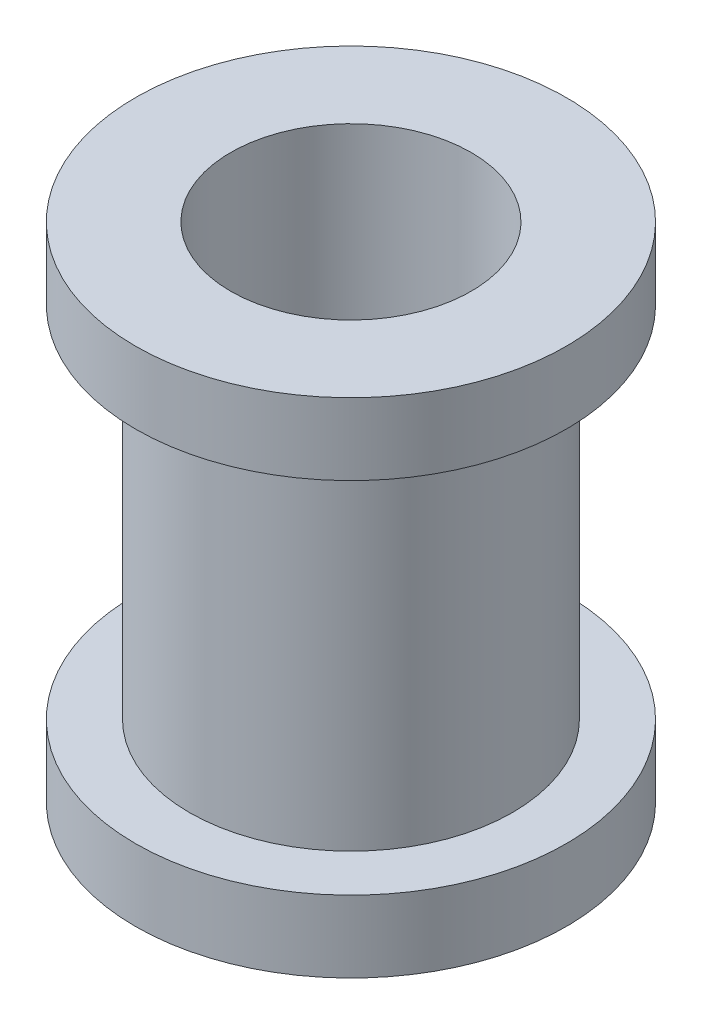
ISO-10303-21;
HEADER;
FILE_DESCRIPTION(('STEP AP214'),'2;1');
FILE_NAME('part.step','',(''),(''),'','','');
FILE_SCHEMA(('AUTOMOTIVE_DESIGN { 1 0 10303 214 1 1 1 1 }'));
ENDSEC;
DATA;
#1=APPLICATION_CONTEXT('core data for automotive mechanical design processes');
#2=APPLICATION_PROTOCOL_DEFINITION('international standard','automotive_design',2000,#1);
#3=PRODUCT_CONTEXT('',#1,'mechanical');
#4=PRODUCT('Part','Part','',(#3));
#5=PRODUCT_RELATED_PRODUCT_CATEGORY('part','',(#4));
#6=PRODUCT_DEFINITION_FORMATION('','',#4);
#7=PRODUCT_DEFINITION_CONTEXT('part definition',#1,'design');
#8=PRODUCT_DEFINITION('design','',#6,#7);
#9=PRODUCT_DEFINITION_SHAPE('','',#8);
#10=(LENGTH_UNIT() NAMED_UNIT(*) SI_UNIT(.MILLI.,.METRE.));
#11=(NAMED_UNIT(*) PLANE_ANGLE_UNIT() SI_UNIT($,.RADIAN.));
#12=(NAMED_UNIT(*) SI_UNIT($,.STERADIAN.) SOLID_ANGLE_UNIT());
#13=UNCERTAINTY_MEASURE_WITH_UNIT(LENGTH_MEASURE(1.E-05),#10,'distance_accuracy_value','');
#14=(GEOMETRIC_REPRESENTATION_CONTEXT(3) GLOBAL_UNCERTAINTY_ASSIGNED_CONTEXT((#13)) GLOBAL_UNIT_ASSIGNED_CONTEXT((#10,
#11,#12)) REPRESENTATION_CONTEXT('',''));
#15=CARTESIAN_POINT('',(0.,0.,0.));
#16=DIRECTION('',(0.,0.,1.));
#17=DIRECTION('',(1.,0.,0.));
#18=AXIS2_PLACEMENT_3D('',#15,#16,#17);
#19=CARTESIAN_POINT('',(0.,5.,0.));
#20=DIRECTION('',(0.,-1.,0.));
#21=DIRECTION('',(0.,0.,-1.));
#22=AXIS2_PLACEMENT_3D('',#19,#20,#21);
#23=CYLINDRICAL_SURFACE('',#22,4.5);
#24=CARTESIAN_POINT('',(0.,5.,0.));
#25=DIRECTION('',(0.,1.,0.));
#26=DIRECTION('',(0.,0.,1.));
#27=AXIS2_PLACEMENT_3D('',#24,#25,#26);
#28=CIRCLE('',#27,4.5);
#29=CARTESIAN_POINT('',(0.,5.,4.5));
#30=VERTEX_POINT('',#29);
#31=EDGE_CURVE('E10',#30,#30,#28,.T.);
#32=ORIENTED_EDGE('',*,*,#31,.F.);
#33=EDGE_LOOP('',(#32));
#34=FACE_BOUND('',#33,.T.);
#35=CARTESIAN_POINT('',(0.,-5.,0.));
#36=DIRECTION('',(0.,1.,0.));
#37=DIRECTION('',(0.,0.,1.));
#38=AXIS2_PLACEMENT_3D('',#35,#36,#37);
#39=CIRCLE('',#38,4.5);
#40=CARTESIAN_POINT('',(0.,-5.,4.5));
#41=VERTEX_POINT('',#40);
#42=EDGE_CURVE('E35',#41,#41,#39,.T.);
#43=ORIENTED_EDGE('',*,*,#42,.T.);
#44=EDGE_LOOP('',(#43));
#45=FACE_BOUND('',#44,.T.);
#46=ADVANCED_FACE('F32',(#34,#45),#23,.T.);
#47=CARTESIAN_POINT('',(0.,5.,0.));
#48=DIRECTION('',(0.,-1.,0.));
#49=DIRECTION('',(0.,0.,-1.));
#50=AXIS2_PLACEMENT_3D('',#47,#48,#49);
#51=CYLINDRICAL_SURFACE('',#50,3.35);
#52=CARTESIAN_POINT('',(0.,7.,0.));
#53=DIRECTION('',(0.,1.,0.));
#54=DIRECTION('',(0.,0.,1.));
#55=AXIS2_PLACEMENT_3D('',#52,#53,#54);
#56=CIRCLE('',#55,3.35);
#57=CARTESIAN_POINT('',(0.,7.,3.35));
#58=VERTEX_POINT('',#57);
#59=EDGE_CURVE('E47',#58,#58,#56,.T.);
#60=ORIENTED_EDGE('',*,*,#59,.T.);
#61=EDGE_LOOP('',(#60));
#62=FACE_BOUND('',#61,.T.);
#63=CARTESIAN_POINT('',(0.,-7.,0.));
#64=DIRECTION('',(0.,1.,0.));
#65=DIRECTION('',(0.,0.,1.));
#66=AXIS2_PLACEMENT_3D('',#63,#64,#65);
#67=CIRCLE('',#66,3.35);
#68=CARTESIAN_POINT('',(0.,-7.,3.35));
#69=VERTEX_POINT('',#68);
#70=EDGE_CURVE('E55',#69,#69,#67,.T.);
#71=ORIENTED_EDGE('',*,*,#70,.F.);
#72=EDGE_LOOP('',(#71));
#73=FACE_BOUND('',#72,.T.);
#74=ADVANCED_FACE('F64',(#62,#73),#51,.F.);
#75=CARTESIAN_POINT('',(0.,7.,0.));
#76=DIRECTION('',(0.,1.,0.));
#77=DIRECTION('',(0.,0.,1.));
#78=AXIS2_PLACEMENT_3D('',#75,#76,#77);
#79=PLANE('',#78);
#80=CARTESIAN_POINT('',(0.,7.,0.));
#81=DIRECTION('',(0.,1.,0.));
#82=DIRECTION('',(0.,0.,1.));
#83=AXIS2_PLACEMENT_3D('',#80,#81,#82);
#84=CIRCLE('',#83,6.);
#85=CARTESIAN_POINT('',(0.,7.,6.));
#86=VERTEX_POINT('',#85);
#87=EDGE_CURVE('E39',#86,#86,#84,.T.);
#88=ORIENTED_EDGE('',*,*,#87,.T.);
#89=EDGE_LOOP('',(#88));
#90=FACE_BOUND('',#89,.T.);
#91=ORIENTED_EDGE('',*,*,#59,.F.);
#92=EDGE_LOOP('',(#91));
#93=FACE_BOUND('',#92,.T.);
#94=ADVANCED_FACE('F66',(#90,#93),#79,.T.);
#95=CARTESIAN_POINT('',(0.,5.,0.));
#96=DIRECTION('',(0.,1.,0.));
#97=DIRECTION('',(0.,0.,1.));
#98=AXIS2_PLACEMENT_3D('',#95,#96,#97);
#99=PLANE('',#98);
#100=ORIENTED_EDGE('',*,*,#31,.T.);
#101=EDGE_LOOP('',(#100));
#102=FACE_BOUND('',#101,.T.);
#103=CARTESIAN_POINT('',(0.,5.,0.));
#104=DIRECTION('',(0.,1.,0.));
#105=DIRECTION('',(0.,0.,1.));
#106=AXIS2_PLACEMENT_3D('',#103,#104,#105);
#107=CIRCLE('',#106,6.);
#108=CARTESIAN_POINT('',(0.,5.,6.));
#109=VERTEX_POINT('',#108);
#110=EDGE_CURVE('E43',#109,#109,#107,.T.);
#111=ORIENTED_EDGE('',*,*,#110,.F.);
#112=EDGE_LOOP('',(#111));
#113=FACE_BOUND('',#112,.T.);
#114=ADVANCED_FACE('F72',(#102,#113),#99,.F.);
#115=CARTESIAN_POINT('',(0.,7.,0.));
#116=DIRECTION('',(0.,-1.,0.));
#117=DIRECTION('',(0.,0.,-1.));
#118=AXIS2_PLACEMENT_3D('',#115,#116,#117);
#119=CYLINDRICAL_SURFACE('',#118,6.);
#120=ORIENTED_EDGE('',*,*,#87,.F.);
#121=EDGE_LOOP('',(#120));
#122=FACE_BOUND('',#121,.T.);
#123=ORIENTED_EDGE('',*,*,#110,.T.);
#124=EDGE_LOOP('',(#123));
#125=FACE_BOUND('',#124,.T.);
#126=ADVANCED_FACE('F77',(#122,#125),#119,.T.);
#127=CARTESIAN_POINT('',(0.,-7.,0.));
#128=DIRECTION('',(0.,1.,0.));
#129=DIRECTION('',(0.,0.,1.));
#130=AXIS2_PLACEMENT_3D('',#127,#128,#129);
#131=CYLINDRICAL_SURFACE('',#130,6.);
#132=CARTESIAN_POINT('',(0.,-7.,0.));
#133=DIRECTION('',(0.,1.,0.));
#134=DIRECTION('',(0.,0.,1.));
#135=AXIS2_PLACEMENT_3D('',#132,#133,#134);
#136=CIRCLE('',#135,6.);
#137=CARTESIAN_POINT('',(0.,-7.,6.));
#138=VERTEX_POINT('',#137);
#139=EDGE_CURVE('E54',#138,#138,#136,.T.);
#140=ORIENTED_EDGE('',*,*,#139,.T.);
#141=EDGE_LOOP('',(#140));
#142=FACE_BOUND('',#141,.T.);
#143=CARTESIAN_POINT('',(0.,-5.,0.));
#144=DIRECTION('',(0.,1.,0.));
#145=DIRECTION('',(0.,0.,1.));
#146=AXIS2_PLACEMENT_3D('',#143,#144,#145);
#147=CIRCLE('',#146,6.);
#148=CARTESIAN_POINT('',(0.,-5.,6.));
#149=VERTEX_POINT('',#148);
#150=EDGE_CURVE('E51',#149,#149,#147,.T.);
#151=ORIENTED_EDGE('',*,*,#150,.F.);
#152=EDGE_LOOP('',(#151));
#153=FACE_BOUND('',#152,.T.);
#154=ADVANCED_FACE('F80',(#142,#153),#131,.T.);
#155=CARTESIAN_POINT('',(0.,-7.,0.));
#156=DIRECTION('',(0.,-1.,0.));
#157=DIRECTION('',(0.,0.,1.));
#158=AXIS2_PLACEMENT_3D('',#155,#156,#157);
#159=PLANE('',#158);
#160=ORIENTED_EDGE('',*,*,#70,.T.);
#161=EDGE_LOOP('',(#160));
#162=FACE_BOUND('',#161,.T.);
#163=ORIENTED_EDGE('',*,*,#139,.F.);
#164=EDGE_LOOP('',(#163));
#165=FACE_BOUND('',#164,.T.);
#166=ADVANCED_FACE('F61',(#162,#165),#159,.T.);
#167=CARTESIAN_POINT('',(0.,-5.,0.));
#168=DIRECTION('',(0.,-1.,0.));
#169=DIRECTION('',(0.,0.,1.));
#170=AXIS2_PLACEMENT_3D('',#167,#168,#169);
#171=PLANE('',#170);
#172=ORIENTED_EDGE('',*,*,#42,.F.);
#173=EDGE_LOOP('',(#172));
#174=FACE_BOUND('',#173,.T.);
#175=ORIENTED_EDGE('',*,*,#150,.T.);
#176=EDGE_LOOP('',(#175));
#177=FACE_BOUND('',#176,.T.);
#178=ADVANCED_FACE('F87',(#174,#177),#171,.F.);
#179=CLOSED_SHELL('',(#46,#74,#94,#114,#126,#154,#166,#178));
#180=MANIFOLD_SOLID_BREP('B2',#179);
#181=ADVANCED_BREP_SHAPE_REPRESENTATION('',(#18,#180),#14);
#182=SHAPE_DEFINITION_REPRESENTATION(#9,#181);
ENDSEC;
END-ISO-10303-21;
